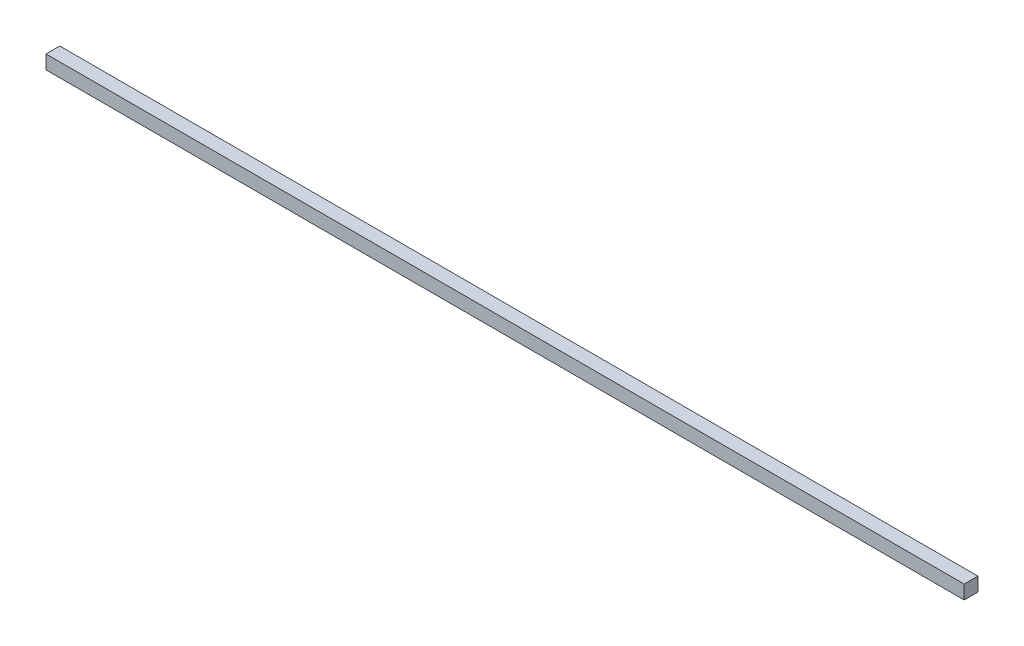
ISO-10303-21;
HEADER;
FILE_DESCRIPTION(('STEP AP214'),'2;1');
FILE_NAME('part.step','',(''),(''),'','','');
FILE_SCHEMA(('AUTOMOTIVE_DESIGN { 1 0 10303 214 1 1 1 1 }'));
ENDSEC;
DATA;
#1=APPLICATION_CONTEXT('core data for automotive mechanical design processes');
#2=APPLICATION_PROTOCOL_DEFINITION('international standard','automotive_design',2000,#1);
#3=PRODUCT_CONTEXT('',#1,'mechanical');
#4=PRODUCT('Part','Part','',(#3));
#5=PRODUCT_RELATED_PRODUCT_CATEGORY('part','',(#4));
#6=PRODUCT_DEFINITION_FORMATION('','',#4);
#7=PRODUCT_DEFINITION_CONTEXT('part definition',#1,'design');
#8=PRODUCT_DEFINITION('design','',#6,#7);
#9=PRODUCT_DEFINITION_SHAPE('','',#8);
#10=(LENGTH_UNIT() NAMED_UNIT(*) SI_UNIT(.MILLI.,.METRE.));
#11=(NAMED_UNIT(*) PLANE_ANGLE_UNIT() SI_UNIT($,.RADIAN.));
#12=(NAMED_UNIT(*) SI_UNIT($,.STERADIAN.) SOLID_ANGLE_UNIT());
#13=UNCERTAINTY_MEASURE_WITH_UNIT(LENGTH_MEASURE(1.E-05),#10,'distance_accuracy_value','');
#14=(GEOMETRIC_REPRESENTATION_CONTEXT(3) GLOBAL_UNCERTAINTY_ASSIGNED_CONTEXT((#13)) GLOBAL_UNIT_ASSIGNED_CONTEXT((#10,
#11,#12)) REPRESENTATION_CONTEXT('',''));
#15=CARTESIAN_POINT('',(0.,0.,0.));
#16=DIRECTION('',(0.,0.,1.));
#17=DIRECTION('',(1.,0.,0.));
#18=AXIS2_PLACEMENT_3D('',#15,#16,#17);
#19=CARTESIAN_POINT('',(0.,0.,15.));
#20=DIRECTION('',(1.,0.,0.));
#21=DIRECTION('',(0.,0.,-1.));
#22=AXIS2_PLACEMENT_3D('',#19,#20,#21);
#23=PLANE('',#22);
#24=DIRECTION('',(0.,-1.,0.));
#25=VECTOR('',#24,1.);
#26=CARTESIAN_POINT('',(0.,0.,0.));
#27=LINE('',#26,#25);
#28=CARTESIAN_POINT('',(0.,15.,0.));
#29=VERTEX_POINT('',#28);
#30=CARTESIAN_POINT('',(0.,0.,0.));
#31=VERTEX_POINT('',#30);
#32=EDGE_CURVE('E106',#29,#31,#27,.T.);
#33=ORIENTED_EDGE('',*,*,#32,.T.);
#34=DIRECTION('',(0.,0.,-1.));
#35=VECTOR('',#34,1.);
#36=CARTESIAN_POINT('',(0.,0.,15.));
#37=LINE('',#36,#35);
#38=CARTESIAN_POINT('',(0.,0.,15.));
#39=VERTEX_POINT('',#38);
#40=EDGE_CURVE('E11',#39,#31,#37,.T.);
#41=ORIENTED_EDGE('',*,*,#40,.F.);
#42=DIRECTION('',(0.,-1.,0.));
#43=VECTOR('',#42,1.);
#44=CARTESIAN_POINT('',(0.,0.,15.));
#45=LINE('',#44,#43);
#46=CARTESIAN_POINT('',(0.,15.,15.));
#47=VERTEX_POINT('',#46);
#48=EDGE_CURVE('E96',#47,#39,#45,.T.);
#49=ORIENTED_EDGE('',*,*,#48,.F.);
#50=DIRECTION('',(0.,0.,-1.));
#51=VECTOR('',#50,1.);
#52=CARTESIAN_POINT('',(0.,15.,15.));
#53=LINE('',#52,#51);
#54=EDGE_CURVE('E101',#47,#29,#53,.T.);
#55=ORIENTED_EDGE('',*,*,#54,.T.);
#56=EDGE_LOOP('',(#33,#41,#49,#55));
#57=FACE_BOUND('',#56,.T.);
#58=ADVANCED_FACE('F44',(#57),#23,.F.);
#59=CARTESIAN_POINT('',(0.,0.,15.));
#60=DIRECTION('',(0.,1.,0.));
#61=DIRECTION('',(0.,0.,1.));
#62=AXIS2_PLACEMENT_3D('',#59,#60,#61);
#63=PLANE('',#62);
#64=DIRECTION('',(1.,0.,0.));
#65=VECTOR('',#64,1.);
#66=CARTESIAN_POINT('',(0.,0.,0.));
#67=LINE('',#66,#65);
#68=CARTESIAN_POINT('',(1000.,0.,0.));
#69=VERTEX_POINT('',#68);
#70=EDGE_CURVE('E99',#31,#69,#67,.T.);
#71=ORIENTED_EDGE('',*,*,#70,.T.);
#72=DIRECTION('',(0.,0.,-1.));
#73=VECTOR('',#72,1.);
#74=CARTESIAN_POINT('',(1000.,0.,15.));
#75=LINE('',#74,#73);
#76=CARTESIAN_POINT('',(1000.,0.,15.));
#77=VERTEX_POINT('',#76);
#78=EDGE_CURVE('E52',#77,#69,#75,.T.);
#79=ORIENTED_EDGE('',*,*,#78,.F.);
#80=DIRECTION('',(1.,0.,0.));
#81=VECTOR('',#80,1.);
#82=CARTESIAN_POINT('',(0.,0.,15.));
#83=LINE('',#82,#81);
#84=EDGE_CURVE('E91',#39,#77,#83,.T.);
#85=ORIENTED_EDGE('',*,*,#84,.F.);
#86=ORIENTED_EDGE('',*,*,#40,.T.);
#87=EDGE_LOOP('',(#71,#79,#85,#86));
#88=FACE_BOUND('',#87,.T.);
#89=ADVANCED_FACE('F98',(#88),#63,.F.);
#90=CARTESIAN_POINT('',(1000.,0.,15.));
#91=DIRECTION('',(-1.,0.,0.));
#92=DIRECTION('',(0.,0.,1.));
#93=AXIS2_PLACEMENT_3D('',#90,#91,#92);
#94=PLANE('',#93);
#95=DIRECTION('',(0.,1.,0.));
#96=VECTOR('',#95,1.);
#97=CARTESIAN_POINT('',(1000.,0.,0.));
#98=LINE('',#97,#96);
#99=CARTESIAN_POINT('',(1000.,15.,0.));
#100=VERTEX_POINT('',#99);
#101=EDGE_CURVE('E76',#69,#100,#98,.T.);
#102=ORIENTED_EDGE('',*,*,#101,.T.);
#103=DIRECTION('',(0.,0.,-1.));
#104=VECTOR('',#103,1.);
#105=CARTESIAN_POINT('',(1000.,15.,15.));
#106=LINE('',#105,#104);
#107=CARTESIAN_POINT('',(1000.,15.,15.));
#108=VERTEX_POINT('',#107);
#109=EDGE_CURVE('E102',#108,#100,#106,.T.);
#110=ORIENTED_EDGE('',*,*,#109,.F.);
#111=DIRECTION('',(0.,1.,0.));
#112=VECTOR('',#111,1.);
#113=CARTESIAN_POINT('',(1000.,0.,15.));
#114=LINE('',#113,#112);
#115=EDGE_CURVE('E92',#77,#108,#114,.T.);
#116=ORIENTED_EDGE('',*,*,#115,.F.);
#117=ORIENTED_EDGE('',*,*,#78,.T.);
#118=EDGE_LOOP('',(#102,#110,#116,#117));
#119=FACE_BOUND('',#118,.T.);
#120=ADVANCED_FACE('F105',(#119),#94,.F.);
#121=CARTESIAN_POINT('',(0.,15.,15.));
#122=DIRECTION('',(0.,-1.,0.));
#123=DIRECTION('',(0.,0.,-1.));
#124=AXIS2_PLACEMENT_3D('',#121,#122,#123);
#125=PLANE('',#124);
#126=DIRECTION('',(-1.,0.,0.));
#127=VECTOR('',#126,1.);
#128=CARTESIAN_POINT('',(0.,15.,0.));
#129=LINE('',#128,#127);
#130=EDGE_CURVE('E84',#100,#29,#129,.T.);
#131=ORIENTED_EDGE('',*,*,#130,.T.);
#132=ORIENTED_EDGE('',*,*,#54,.F.);
#133=DIRECTION('',(-1.,0.,0.));
#134=VECTOR('',#133,1.);
#135=CARTESIAN_POINT('',(0.,15.,15.));
#136=LINE('',#135,#134);
#137=EDGE_CURVE('E63',#108,#47,#136,.T.);
#138=ORIENTED_EDGE('',*,*,#137,.F.);
#139=ORIENTED_EDGE('',*,*,#109,.T.);
#140=EDGE_LOOP('',(#131,#132,#138,#139));
#141=FACE_BOUND('',#140,.T.);
#142=ADVANCED_FACE('F113',(#141),#125,.F.);
#143=CARTESIAN_POINT('',(0.,0.,15.));
#144=DIRECTION('',(0.,0.,-1.));
#145=DIRECTION('',(-1.,0.,0.));
#146=AXIS2_PLACEMENT_3D('',#143,#144,#145);
#147=PLANE('',#146);
#148=ORIENTED_EDGE('',*,*,#48,.T.);
#149=ORIENTED_EDGE('',*,*,#84,.T.);
#150=ORIENTED_EDGE('',*,*,#115,.T.);
#151=ORIENTED_EDGE('',*,*,#137,.T.);
#152=EDGE_LOOP('',(#148,#149,#150,#151));
#153=FACE_BOUND('',#152,.T.);
#154=ADVANCED_FACE('F95',(#153),#147,.F.);
#155=CARTESIAN_POINT('',(0.,0.,0.));
#156=DIRECTION('',(0.,0.,-1.));
#157=DIRECTION('',(-1.,0.,0.));
#158=AXIS2_PLACEMENT_3D('',#155,#156,#157);
#159=PLANE('',#158);
#160=ORIENTED_EDGE('',*,*,#32,.F.);
#161=ORIENTED_EDGE('',*,*,#130,.F.);
#162=ORIENTED_EDGE('',*,*,#101,.F.);
#163=ORIENTED_EDGE('',*,*,#70,.F.);
#164=EDGE_LOOP('',(#160,#161,#162,#163));
#165=FACE_BOUND('',#164,.T.);
#166=ADVANCED_FACE('F116',(#165),#159,.T.);
#167=CLOSED_SHELL('',(#58,#89,#120,#142,#154,#166));
#168=MANIFOLD_SOLID_BREP('B2',#167);
#169=ADVANCED_BREP_SHAPE_REPRESENTATION('',(#18,#168),#14);
#170=SHAPE_DEFINITION_REPRESENTATION(#9,#169);
ENDSEC;
END-ISO-10303-21;
